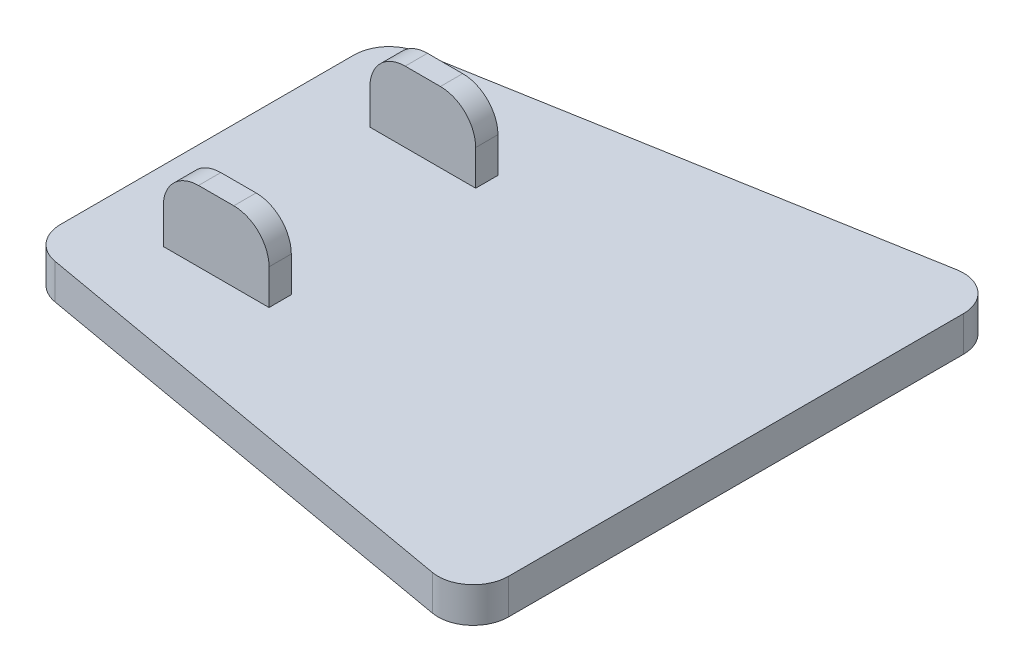
ISO-10303-21;
HEADER;
FILE_DESCRIPTION(('STEP AP214'),'2;1');
FILE_NAME('part.step','',(''),(''),'','','');
FILE_SCHEMA(('AUTOMOTIVE_DESIGN { 1 0 10303 214 1 1 1 1 }'));
ENDSEC;
DATA;
#1=APPLICATION_CONTEXT('core data for automotive mechanical design processes');
#2=APPLICATION_PROTOCOL_DEFINITION('international standard','automotive_design',2000,#1);
#3=PRODUCT_CONTEXT('',#1,'mechanical');
#4=PRODUCT('Part','Part','',(#3));
#5=PRODUCT_RELATED_PRODUCT_CATEGORY('part','',(#4));
#6=PRODUCT_DEFINITION_FORMATION('','',#4);
#7=PRODUCT_DEFINITION_CONTEXT('part definition',#1,'design');
#8=PRODUCT_DEFINITION('design','',#6,#7);
#9=PRODUCT_DEFINITION_SHAPE('','',#8);
#10=(LENGTH_UNIT() NAMED_UNIT(*) SI_UNIT(.MILLI.,.METRE.));
#11=(NAMED_UNIT(*) PLANE_ANGLE_UNIT() SI_UNIT($,.RADIAN.));
#12=(NAMED_UNIT(*) SI_UNIT($,.STERADIAN.) SOLID_ANGLE_UNIT());
#13=UNCERTAINTY_MEASURE_WITH_UNIT(LENGTH_MEASURE(1.E-05),#10,'distance_accuracy_value','');
#14=(GEOMETRIC_REPRESENTATION_CONTEXT(3) GLOBAL_UNCERTAINTY_ASSIGNED_CONTEXT((#13)) GLOBAL_UNIT_ASSIGNED_CONTEXT((#10,
#11,#12)) REPRESENTATION_CONTEXT('',''));
#15=CARTESIAN_POINT('',(0.,0.,0.));
#16=DIRECTION('',(0.,0.,1.));
#17=DIRECTION('',(1.,0.,0.));
#18=AXIS2_PLACEMENT_3D('',#15,#16,#17);
#19=CARTESIAN_POINT('',(0.,10.,0.));
#20=DIRECTION('',(0.,-1.,0.));
#21=DIRECTION('',(0.,0.,-1.));
#22=AXIS2_PLACEMENT_3D('',#19,#20,#21);
#23=PLANE('',#22);
#24=DIRECTION('',(0.,0.,1.));
#25=VECTOR('',#24,1.);
#26=CARTESIAN_POINT('',(20.,10.,-32.4728035453542));
#27=LINE('',#26,#25);
#28=CARTESIAN_POINT('',(20.,10.,-32.4728035453542));
#29=VERTEX_POINT('',#28);
#30=CARTESIAN_POINT('',(20.,10.,-26.1538642368434));
#31=VERTEX_POINT('',#30);
#32=EDGE_CURVE('E224',#29,#31,#27,.T.);
#33=ORIENTED_EDGE('',*,*,#32,.F.);
#34=DIRECTION('',(-1.,0.,0.));
#35=VECTOR('',#34,1.);
#36=CARTESIAN_POINT('',(20.,10.,-32.4728035453542));
#37=LINE('',#36,#35);
#38=CARTESIAN_POINT('',(50.,10.,-32.4728035453542));
#39=VERTEX_POINT('',#38);
#40=EDGE_CURVE('E229',#39,#29,#37,.T.);
#41=ORIENTED_EDGE('',*,*,#40,.F.);
#42=DIRECTION('',(0.,0.,-1.));
#43=VECTOR('',#42,1.);
#44=CARTESIAN_POINT('',(50.,10.,-32.4728035453542));
#45=LINE('',#44,#43);
#46=CARTESIAN_POINT('',(50.,10.,-26.1538642368434));
#47=VERTEX_POINT('',#46);
#48=EDGE_CURVE('E238',#47,#39,#45,.T.);
#49=ORIENTED_EDGE('',*,*,#48,.F.);
#50=DIRECTION('',(1.,0.,0.));
#51=VECTOR('',#50,1.);
#52=CARTESIAN_POINT('',(20.,10.,-26.1538642368434));
#53=LINE('',#52,#51);
#54=EDGE_CURVE('E235',#31,#47,#53,.T.);
#55=ORIENTED_EDGE('',*,*,#54,.F.);
#56=EDGE_LOOP('',(#33,#41,#49,#55));
#57=FACE_BOUND('',#56,.T.);
#58=DIRECTION('',(0.,0.,1.));
#59=VECTOR('',#58,1.);
#60=CARTESIAN_POINT('',(150.,10.,-76.4490471062692));
#61=LINE('',#60,#59);
#62=CARTESIAN_POINT('',(150.,10.,-64.5315111803272));
#63=VERTEX_POINT('',#62);
#64=CARTESIAN_POINT('',(150.,10.,64.5315111803271));
#65=VERTEX_POINT('',#64);
#66=EDGE_CURVE('E260',#63,#65,#61,.T.);
#67=ORIENTED_EDGE('',*,*,#66,.F.);
#68=CARTESIAN_POINT('',(140.,10.,-64.5315111803272));
#69=DIRECTION('',(0.,-1.,0.));
#70=DIRECTION('',(0.,0.,-1.));
#71=AXIS2_PLACEMENT_3D('',#68,#69,#70);
#72=CIRCLE('',#71,10.);
#73=CARTESIAN_POINT('',(138.263518223331,10.,-74.3795887104493));
#74=VERTEX_POINT('',#73);
#75=EDGE_CURVE('E314',#63,#74,#72,.F.);
#76=ORIENTED_EDGE('',*,*,#75,.T.);
#77=DIRECTION('',(0.984807753012209,0.,-0.173648177666927));
#78=VECTOR('',#77,1.);
#79=CARTESIAN_POINT('',(0.,10.,-50.));
#80=LINE('',#79,#78);
#81=CARTESIAN_POINT('',(8.26351822333073,10.,-51.4570812183493));
#82=VERTEX_POINT('',#81);
#83=EDGE_CURVE('E257',#82,#74,#80,.T.);
#84=ORIENTED_EDGE('',*,*,#83,.F.);
#85=CARTESIAN_POINT('',(10.,10.,-41.6090036882272));
#86=DIRECTION('',(0.,-1.,0.));
#87=DIRECTION('',(0.,0.,-1.));
#88=AXIS2_PLACEMENT_3D('',#85,#86,#87);
#89=CIRCLE('',#88,10.);
#90=CARTESIAN_POINT('',(0.,10.,-41.6090036882272));
#91=VERTEX_POINT('',#90);
#92=EDGE_CURVE('E48',#82,#91,#89,.F.);
#93=ORIENTED_EDGE('',*,*,#92,.T.);
#94=DIRECTION('',(0.,0.,-1.));
#95=VECTOR('',#94,1.);
#96=CARTESIAN_POINT('',(0.,10.,50.));
#97=LINE('',#96,#95);
#98=CARTESIAN_POINT('',(0.,10.,41.6090036882272));
#99=VERTEX_POINT('',#98);
#100=EDGE_CURVE('E254',#99,#91,#97,.T.);
#101=ORIENTED_EDGE('',*,*,#100,.F.);
#102=CARTESIAN_POINT('',(10.,10.,41.6090036882272));
#103=DIRECTION('',(0.,-1.,0.));
#104=DIRECTION('',(0.,0.,-1.));
#105=AXIS2_PLACEMENT_3D('',#102,#103,#104);
#106=CIRCLE('',#105,10.);
#107=CARTESIAN_POINT('',(8.26351822333071,10.,51.4570812183493));
#108=VERTEX_POINT('',#107);
#109=EDGE_CURVE('E310',#99,#108,#106,.F.);
#110=ORIENTED_EDGE('',*,*,#109,.T.);
#111=DIRECTION('',(-0.984807753012209,0.,-0.173648177666927));
#112=VECTOR('',#111,1.);
#113=CARTESIAN_POINT('',(150.,10.,76.4490471062691));
#114=LINE('',#113,#112);
#115=CARTESIAN_POINT('',(138.263518223331,10.,74.3795887104492));
#116=VERTEX_POINT('',#115);
#117=EDGE_CURVE('E251',#116,#108,#114,.T.);
#118=ORIENTED_EDGE('',*,*,#117,.F.);
#119=CARTESIAN_POINT('',(140.,10.,64.5315111803271));
#120=DIRECTION('',(0.,-1.,0.));
#121=DIRECTION('',(0.,0.,-1.));
#122=AXIS2_PLACEMENT_3D('',#119,#120,#121);
#123=CIRCLE('',#122,10.);
#124=EDGE_CURVE('E312',#116,#65,#123,.F.);
#125=ORIENTED_EDGE('',*,*,#124,.T.);
#126=EDGE_LOOP('',(#67,#76,#84,#93,#101,#110,#118,#125));
#127=FACE_BOUND('',#126,.T.);
#128=DIRECTION('',(0.,0.,-1.));
#129=VECTOR('',#128,1.);
#130=CARTESIAN_POINT('',(20.,10.,32.4728035453542));
#131=LINE('',#130,#129);
#132=CARTESIAN_POINT('',(20.,10.,32.4728035453542));
#133=VERTEX_POINT('',#132);
#134=CARTESIAN_POINT('',(20.,10.,26.1538642368434));
#135=VERTEX_POINT('',#134);
#136=EDGE_CURVE('E588',#133,#135,#131,.T.);
#137=ORIENTED_EDGE('',*,*,#136,.T.);
#138=DIRECTION('',(1.,0.,0.));
#139=VECTOR('',#138,1.);
#140=CARTESIAN_POINT('',(20.,10.,26.1538642368434));
#141=LINE('',#140,#139);
#142=CARTESIAN_POINT('',(50.,10.,26.1538642368434));
#143=VERTEX_POINT('',#142);
#144=EDGE_CURVE('E175',#135,#143,#141,.T.);
#145=ORIENTED_EDGE('',*,*,#144,.T.);
#146=DIRECTION('',(0.,0.,1.));
#147=VECTOR('',#146,1.);
#148=CARTESIAN_POINT('',(50.,10.,32.4728035453542));
#149=LINE('',#148,#147);
#150=CARTESIAN_POINT('',(50.,10.,32.4728035453542));
#151=VERTEX_POINT('',#150);
#152=EDGE_CURVE('E169',#143,#151,#149,.T.);
#153=ORIENTED_EDGE('',*,*,#152,.T.);
#154=DIRECTION('',(-1.,0.,0.));
#155=VECTOR('',#154,1.);
#156=CARTESIAN_POINT('',(20.,10.,32.4728035453542));
#157=LINE('',#156,#155);
#158=EDGE_CURVE('E172',#151,#133,#157,.T.);
#159=ORIENTED_EDGE('',*,*,#158,.T.);
#160=EDGE_LOOP('',(#137,#145,#153,#159));
#161=FACE_BOUND('',#160,.T.);
#162=ADVANCED_FACE('F33',(#57,#127,#161),#23,.F.);
#163=CARTESIAN_POINT('',(150.,10.,76.4490471062691));
#164=DIRECTION('',(-0.173648177666927,0.,0.984807753012209));
#165=DIRECTION('',(0.984807753012209,0.,0.173648177666927));
#166=AXIS2_PLACEMENT_3D('',#163,#164,#165);
#167=PLANE('',#166);
#168=DIRECTION('',(-0.984807753012209,0.,-0.173648177666927));
#169=VECTOR('',#168,1.);
#170=CARTESIAN_POINT('',(150.,0.,76.4490471062691));
#171=LINE('',#170,#169);
#172=CARTESIAN_POINT('',(138.263518223331,0.,74.3795887104492));
#173=VERTEX_POINT('',#172);
#174=CARTESIAN_POINT('',(8.26351822333071,0.,51.4570812183493));
#175=VERTEX_POINT('',#174);
#176=EDGE_CURVE('E250',#173,#175,#171,.T.);
#177=ORIENTED_EDGE('',*,*,#176,.F.);
#178=DIRECTION('',(0.,-1.,0.));
#179=VECTOR('',#178,1.);
#180=CARTESIAN_POINT('',(138.263518223331,10.,74.3795887104492));
#181=LINE('',#180,#179);
#182=EDGE_CURVE('E319',#173,#116,#181,.F.);
#183=ORIENTED_EDGE('',*,*,#182,.T.);
#184=ORIENTED_EDGE('',*,*,#117,.T.);
#185=DIRECTION('',(0.,-1.,0.));
#186=VECTOR('',#185,1.);
#187=CARTESIAN_POINT('',(8.26351822333074,10.,51.4570812183493));
#188=LINE('',#187,#186);
#189=EDGE_CURVE('E316',#108,#175,#188,.T.);
#190=ORIENTED_EDGE('',*,*,#189,.T.);
#191=EDGE_LOOP('',(#177,#183,#184,#190));
#192=FACE_BOUND('',#191,.T.);
#193=ADVANCED_FACE('F333',(#192),#167,.T.);
#194=CARTESIAN_POINT('',(150.,10.,-76.4490471062692));
#195=DIRECTION('',(1.,0.,0.));
#196=DIRECTION('',(0.,0.,-1.));
#197=AXIS2_PLACEMENT_3D('',#194,#195,#196);
#198=PLANE('',#197);
#199=DIRECTION('',(0.,0.,1.));
#200=VECTOR('',#199,1.);
#201=CARTESIAN_POINT('',(150.,0.,-76.4490471062692));
#202=LINE('',#201,#200);
#203=CARTESIAN_POINT('',(150.,0.,-64.5315111803272));
#204=VERTEX_POINT('',#203);
#205=CARTESIAN_POINT('',(150.,0.,64.5315111803271));
#206=VERTEX_POINT('',#205);
#207=EDGE_CURVE('E255',#204,#206,#202,.T.);
#208=ORIENTED_EDGE('',*,*,#207,.F.);
#209=DIRECTION('',(0.,-1.,0.));
#210=VECTOR('',#209,1.);
#211=CARTESIAN_POINT('',(150.,10.,-64.5315111803272));
#212=LINE('',#211,#210);
#213=EDGE_CURVE('E307',#204,#63,#212,.F.);
#214=ORIENTED_EDGE('',*,*,#213,.T.);
#215=ORIENTED_EDGE('',*,*,#66,.T.);
#216=DIRECTION('',(0.,-1.,0.));
#217=VECTOR('',#216,1.);
#218=CARTESIAN_POINT('',(150.,10.,64.5315111803271));
#219=LINE('',#218,#217);
#220=EDGE_CURVE('E304',#65,#206,#219,.T.);
#221=ORIENTED_EDGE('',*,*,#220,.T.);
#222=EDGE_LOOP('',(#208,#214,#215,#221));
#223=FACE_BOUND('',#222,.T.);
#224=ADVANCED_FACE('F343',(#223),#198,.T.);
#225=CARTESIAN_POINT('',(0.,10.,-50.));
#226=DIRECTION('',(-0.173648177666927,0.,-0.984807753012209));
#227=DIRECTION('',(-0.984807753012209,0.,0.173648177666927));
#228=AXIS2_PLACEMENT_3D('',#225,#226,#227);
#229=PLANE('',#228);
#230=ORIENTED_EDGE('',*,*,#83,.T.);
#231=DIRECTION('',(0.,-1.,0.));
#232=VECTOR('',#231,1.);
#233=CARTESIAN_POINT('',(138.263518223331,10.,-74.3795887104493));
#234=LINE('',#233,#232);
#235=CARTESIAN_POINT('',(138.263518223331,0.,-74.3795887104493));
#236=VERTEX_POINT('',#235);
#237=EDGE_CURVE('E293',#74,#236,#234,.T.);
#238=ORIENTED_EDGE('',*,*,#237,.T.);
#239=DIRECTION('',(0.984807753012209,0.,-0.173648177666927));
#240=VECTOR('',#239,1.);
#241=CARTESIAN_POINT('',(0.,0.,-50.));
#242=LINE('',#241,#240);
#243=CARTESIAN_POINT('',(8.26351822333073,0.,-51.4570812183493));
#244=VERTEX_POINT('',#243);
#245=EDGE_CURVE('E269',#244,#236,#242,.T.);
#246=ORIENTED_EDGE('',*,*,#245,.F.);
#247=DIRECTION('',(0.,-1.,0.));
#248=VECTOR('',#247,1.);
#249=CARTESIAN_POINT('',(8.26351822333073,10.,-51.4570812183493));
#250=LINE('',#249,#248);
#251=EDGE_CURVE('E291',#244,#82,#250,.F.);
#252=ORIENTED_EDGE('',*,*,#251,.T.);
#253=EDGE_LOOP('',(#230,#238,#246,#252));
#254=FACE_BOUND('',#253,.T.);
#255=ADVANCED_FACE('F350',(#254),#229,.T.);
#256=CARTESIAN_POINT('',(0.,10.,0.));
#257=DIRECTION('',(-1.,0.,0.));
#258=DIRECTION('',(0.,0.,1.));
#259=AXIS2_PLACEMENT_3D('',#256,#257,#258);
#260=PLANE('',#259);
#261=DIRECTION('',(0.,0.,-1.));
#262=VECTOR('',#261,1.);
#263=CARTESIAN_POINT('',(0.,0.,0.));
#264=LINE('',#263,#262);
#265=CARTESIAN_POINT('',(0.,0.,41.6090036882272));
#266=VERTEX_POINT('',#265);
#267=CARTESIAN_POINT('',(0.,0.,-41.6090036882272));
#268=VERTEX_POINT('',#267);
#269=EDGE_CURVE('E266',#266,#268,#264,.T.);
#270=ORIENTED_EDGE('',*,*,#269,.F.);
#271=DIRECTION('',(0.,-1.,0.));
#272=VECTOR('',#271,1.);
#273=CARTESIAN_POINT('',(0.,10.,41.6090036882272));
#274=LINE('',#273,#272);
#275=EDGE_CURVE('E11',#266,#99,#274,.F.);
#276=ORIENTED_EDGE('',*,*,#275,.T.);
#277=ORIENTED_EDGE('',*,*,#100,.T.);
#278=DIRECTION('',(0.,-1.,0.));
#279=VECTOR('',#278,1.);
#280=CARTESIAN_POINT('',(0.,10.,-41.6090036882272));
#281=LINE('',#280,#279);
#282=EDGE_CURVE('E41',#91,#268,#281,.T.);
#283=ORIENTED_EDGE('',*,*,#282,.T.);
#284=EDGE_LOOP('',(#270,#276,#277,#283));
#285=FACE_BOUND('',#284,.T.);
#286=ADVANCED_FACE('F322',(#285),#260,.T.);
#287=CARTESIAN_POINT('',(0.,0.,0.));
#288=DIRECTION('',(0.,-1.,0.));
#289=DIRECTION('',(0.,0.,-1.));
#290=AXIS2_PLACEMENT_3D('',#287,#288,#289);
#291=PLANE('',#290);
#292=ORIENTED_EDGE('',*,*,#245,.T.);
#293=CARTESIAN_POINT('',(140.,0.,-64.5315111803272));
#294=DIRECTION('',(0.,-1.,0.));
#295=DIRECTION('',(0.,0.,-1.));
#296=AXIS2_PLACEMENT_3D('',#293,#294,#295);
#297=CIRCLE('',#296,10.);
#298=EDGE_CURVE('E302',#236,#204,#297,.T.);
#299=ORIENTED_EDGE('',*,*,#298,.T.);
#300=ORIENTED_EDGE('',*,*,#207,.T.);
#301=CARTESIAN_POINT('',(140.,0.,64.5315111803271));
#302=DIRECTION('',(0.,-1.,0.));
#303=DIRECTION('',(0.,0.,-1.));
#304=AXIS2_PLACEMENT_3D('',#301,#302,#303);
#305=CIRCLE('',#304,10.);
#306=EDGE_CURVE('E300',#206,#173,#305,.T.);
#307=ORIENTED_EDGE('',*,*,#306,.T.);
#308=ORIENTED_EDGE('',*,*,#176,.T.);
#309=CARTESIAN_POINT('',(10.,0.,41.6090036882272));
#310=DIRECTION('',(0.,-1.,0.));
#311=DIRECTION('',(0.,0.,-1.));
#312=AXIS2_PLACEMENT_3D('',#309,#310,#311);
#313=CIRCLE('',#312,10.);
#314=EDGE_CURVE('E298',#175,#266,#313,.T.);
#315=ORIENTED_EDGE('',*,*,#314,.T.);
#316=ORIENTED_EDGE('',*,*,#269,.T.);
#317=CARTESIAN_POINT('',(10.,0.,-41.6090036882272));
#318=DIRECTION('',(0.,-1.,0.));
#319=DIRECTION('',(0.,0.,-1.));
#320=AXIS2_PLACEMENT_3D('',#317,#318,#319);
#321=CIRCLE('',#320,10.);
#322=EDGE_CURVE('E296',#268,#244,#321,.T.);
#323=ORIENTED_EDGE('',*,*,#322,.T.);
#324=EDGE_LOOP('',(#292,#299,#300,#307,#308,#315,#316,#323));
#325=FACE_BOUND('',#324,.T.);
#326=ADVANCED_FACE('F325',(#325),#291,.T.);
#327=CARTESIAN_POINT('',(20.,30.,-32.4728035453542));
#328=DIRECTION('',(1.,0.,0.));
#329=DIRECTION('',(0.,0.,-1.));
#330=AXIS2_PLACEMENT_3D('',#327,#328,#329);
#331=PLANE('',#330);
#332=DIRECTION('',(0.,-1.,0.));
#333=VECTOR('',#332,1.);
#334=CARTESIAN_POINT('',(20.,30.,-26.1538642368434));
#335=LINE('',#334,#333);
#336=CARTESIAN_POINT('',(20.,20.,-26.1538642368434));
#337=VERTEX_POINT('',#336);
#338=EDGE_CURVE('E248',#337,#31,#335,.T.);
#339=ORIENTED_EDGE('',*,*,#338,.F.);
#340=DIRECTION('',(0.,0.,1.));
#341=VECTOR('',#340,1.);
#342=CARTESIAN_POINT('',(20.,20.,-32.4728035453542));
#343=LINE('',#342,#341);
#344=CARTESIAN_POINT('',(20.,20.,-32.4728035453542));
#345=VERTEX_POINT('',#344);
#346=EDGE_CURVE('E289',#337,#345,#343,.F.);
#347=ORIENTED_EDGE('',*,*,#346,.T.);
#348=DIRECTION('',(0.,-1.,0.));
#349=VECTOR('',#348,1.);
#350=CARTESIAN_POINT('',(20.,30.,-32.4728035453542));
#351=LINE('',#350,#349);
#352=EDGE_CURVE('E232',#345,#29,#351,.T.);
#353=ORIENTED_EDGE('',*,*,#352,.T.);
#354=ORIENTED_EDGE('',*,*,#32,.T.);
#355=EDGE_LOOP('',(#339,#347,#353,#354));
#356=FACE_BOUND('',#355,.T.);
#357=ADVANCED_FACE('F366',(#356),#331,.F.);
#358=CARTESIAN_POINT('',(20.,30.,-26.1538642368434));
#359=DIRECTION('',(0.,0.,-1.));
#360=DIRECTION('',(-1.,0.,0.));
#361=AXIS2_PLACEMENT_3D('',#358,#359,#360);
#362=PLANE('',#361);
#363=DIRECTION('',(0.,-1.,0.));
#364=VECTOR('',#363,1.);
#365=CARTESIAN_POINT('',(50.,30.,-26.1538642368434));
#366=LINE('',#365,#364);
#367=CARTESIAN_POINT('',(50.,20.,-26.1538642368434));
#368=VERTEX_POINT('',#367);
#369=EDGE_CURVE('E246',#368,#47,#366,.T.);
#370=ORIENTED_EDGE('',*,*,#369,.F.);
#371=CARTESIAN_POINT('',(40.,20.,-26.1538642368434));
#372=DIRECTION('',(0.,0.,-1.));
#373=DIRECTION('',(-1.,0.,0.));
#374=AXIS2_PLACEMENT_3D('',#371,#372,#373);
#375=CIRCLE('',#374,10.);
#376=CARTESIAN_POINT('',(40.,30.,-26.1538642368434));
#377=VERTEX_POINT('',#376);
#378=EDGE_CURVE('E287',#368,#377,#375,.F.);
#379=ORIENTED_EDGE('',*,*,#378,.T.);
#380=DIRECTION('',(1.,0.,0.));
#381=VECTOR('',#380,1.);
#382=CARTESIAN_POINT('',(20.,30.,-26.1538642368434));
#383=LINE('',#382,#381);
#384=CARTESIAN_POINT('',(30.,30.,-26.1538642368434));
#385=VERTEX_POINT('',#384);
#386=EDGE_CURVE('E225',#385,#377,#383,.T.);
#387=ORIENTED_EDGE('',*,*,#386,.F.);
#388=CARTESIAN_POINT('',(30.,20.,-26.1538642368434));
#389=DIRECTION('',(0.,0.,-1.));
#390=DIRECTION('',(-1.,0.,0.));
#391=AXIS2_PLACEMENT_3D('',#388,#389,#390);
#392=CIRCLE('',#391,10.);
#393=EDGE_CURVE('E285',#385,#337,#392,.F.);
#394=ORIENTED_EDGE('',*,*,#393,.T.);
#395=ORIENTED_EDGE('',*,*,#338,.T.);
#396=ORIENTED_EDGE('',*,*,#54,.T.);
#397=EDGE_LOOP('',(#370,#379,#387,#394,#395,#396));
#398=FACE_BOUND('',#397,.T.);
#399=ADVANCED_FACE('F501',(#398),#362,.F.);
#400=CARTESIAN_POINT('',(50.,30.,-32.4728035453542));
#401=DIRECTION('',(-1.,0.,0.));
#402=DIRECTION('',(0.,0.,1.));
#403=AXIS2_PLACEMENT_3D('',#400,#401,#402);
#404=PLANE('',#403);
#405=DIRECTION('',(0.,-1.,0.));
#406=VECTOR('',#405,1.);
#407=CARTESIAN_POINT('',(50.,30.,-32.4728035453542));
#408=LINE('',#407,#406);
#409=CARTESIAN_POINT('',(50.,20.,-32.4728035453542));
#410=VERTEX_POINT('',#409);
#411=EDGE_CURVE('E244',#410,#39,#408,.T.);
#412=ORIENTED_EDGE('',*,*,#411,.F.);
#413=DIRECTION('',(0.,0.,-1.));
#414=VECTOR('',#413,1.);
#415=CARTESIAN_POINT('',(50.,20.,-26.1538642368434));
#416=LINE('',#415,#414);
#417=EDGE_CURVE('E283',#410,#368,#416,.F.);
#418=ORIENTED_EDGE('',*,*,#417,.T.);
#419=ORIENTED_EDGE('',*,*,#369,.T.);
#420=ORIENTED_EDGE('',*,*,#48,.T.);
#421=EDGE_LOOP('',(#412,#418,#419,#420));
#422=FACE_BOUND('',#421,.T.);
#423=ADVANCED_FACE('F491',(#422),#404,.F.);
#424=CARTESIAN_POINT('',(20.,30.,-32.4728035453542));
#425=DIRECTION('',(0.,0.,1.));
#426=DIRECTION('',(1.,0.,0.));
#427=AXIS2_PLACEMENT_3D('',#424,#425,#426);
#428=PLANE('',#427);
#429=DIRECTION('',(-1.,0.,0.));
#430=VECTOR('',#429,1.);
#431=CARTESIAN_POINT('',(20.,30.,-32.4728035453542));
#432=LINE('',#431,#430);
#433=CARTESIAN_POINT('',(40.,30.,-32.4728035453542));
#434=VERTEX_POINT('',#433);
#435=CARTESIAN_POINT('',(30.,30.,-32.4728035453542));
#436=VERTEX_POINT('',#435);
#437=EDGE_CURVE('E228',#434,#436,#432,.T.);
#438=ORIENTED_EDGE('',*,*,#437,.F.);
#439=CARTESIAN_POINT('',(40.,20.,-32.4728035453542));
#440=DIRECTION('',(0.,0.,1.));
#441=DIRECTION('',(1.,0.,0.));
#442=AXIS2_PLACEMENT_3D('',#439,#440,#441);
#443=CIRCLE('',#442,10.);
#444=EDGE_CURVE('E281',#434,#410,#443,.F.);
#445=ORIENTED_EDGE('',*,*,#444,.T.);
#446=ORIENTED_EDGE('',*,*,#411,.T.);
#447=ORIENTED_EDGE('',*,*,#40,.T.);
#448=ORIENTED_EDGE('',*,*,#352,.F.);
#449=CARTESIAN_POINT('',(30.,20.,-32.4728035453542));
#450=DIRECTION('',(0.,0.,1.));
#451=DIRECTION('',(1.,0.,0.));
#452=AXIS2_PLACEMENT_3D('',#449,#450,#451);
#453=CIRCLE('',#452,10.);
#454=EDGE_CURVE('E279',#345,#436,#453,.F.);
#455=ORIENTED_EDGE('',*,*,#454,.T.);
#456=EDGE_LOOP('',(#438,#445,#446,#447,#448,#455));
#457=FACE_BOUND('',#456,.T.);
#458=ADVANCED_FACE('F481',(#457),#428,.F.);
#459=CARTESIAN_POINT('',(0.,30.,0.));
#460=DIRECTION('',(0.,1.,0.));
#461=DIRECTION('',(0.,0.,1.));
#462=AXIS2_PLACEMENT_3D('',#459,#460,#461);
#463=PLANE('',#462);
#464=ORIENTED_EDGE('',*,*,#386,.T.);
#465=DIRECTION('',(0.,0.,-1.));
#466=VECTOR('',#465,1.);
#467=CARTESIAN_POINT('',(40.,30.,-32.4728035453542));
#468=LINE('',#467,#466);
#469=EDGE_CURVE('E276',#377,#434,#468,.T.);
#470=ORIENTED_EDGE('',*,*,#469,.T.);
#471=ORIENTED_EDGE('',*,*,#437,.T.);
#472=DIRECTION('',(0.,0.,1.));
#473=VECTOR('',#472,1.);
#474=CARTESIAN_POINT('',(30.,30.,-26.1538642368434));
#475=LINE('',#474,#473);
#476=EDGE_CURVE('E263',#436,#385,#475,.T.);
#477=ORIENTED_EDGE('',*,*,#476,.T.);
#478=EDGE_LOOP('',(#464,#470,#471,#477));
#479=FACE_BOUND('',#478,.T.);
#480=ADVANCED_FACE('F380',(#479),#463,.T.);
#481=CARTESIAN_POINT('',(40.,20.,0.));
#482=DIRECTION('',(0.,0.,1.));
#483=DIRECTION('',(1.,0.,0.));
#484=AXIS2_PLACEMENT_3D('',#481,#482,#483);
#485=CYLINDRICAL_SURFACE('',#484,10.);
#486=ORIENTED_EDGE('',*,*,#378,.F.);
#487=ORIENTED_EDGE('',*,*,#417,.F.);
#488=ORIENTED_EDGE('',*,*,#444,.F.);
#489=ORIENTED_EDGE('',*,*,#469,.F.);
#490=EDGE_LOOP('',(#486,#487,#488,#489));
#491=FACE_BOUND('',#490,.T.);
#492=ADVANCED_FACE('F376',(#491),#485,.T.);
#493=CARTESIAN_POINT('',(30.,20.,0.));
#494=DIRECTION('',(0.,0.,-1.));
#495=DIRECTION('',(-1.,0.,0.));
#496=AXIS2_PLACEMENT_3D('',#493,#494,#495);
#497=CYLINDRICAL_SURFACE('',#496,10.);
#498=ORIENTED_EDGE('',*,*,#454,.F.);
#499=ORIENTED_EDGE('',*,*,#346,.F.);
#500=ORIENTED_EDGE('',*,*,#393,.F.);
#501=ORIENTED_EDGE('',*,*,#476,.F.);
#502=EDGE_LOOP('',(#498,#499,#500,#501));
#503=FACE_BOUND('',#502,.T.);
#504=ADVANCED_FACE('F379',(#503),#497,.T.);
#505=CARTESIAN_POINT('',(20.,30.,32.4728035453542));
#506=DIRECTION('',(1.,0.,0.));
#507=DIRECTION('',(0.,0.,1.));
#508=AXIS2_PLACEMENT_3D('',#505,#506,#507);
#509=PLANE('',#508);
#510=DIRECTION('',(0.,-1.,0.));
#511=VECTOR('',#510,1.);
#512=CARTESIAN_POINT('',(20.,30.,26.1538642368434));
#513=LINE('',#512,#511);
#514=CARTESIAN_POINT('',(20.,20.,26.1538642368434));
#515=VERTEX_POINT('',#514);
#516=EDGE_CURVE('E203',#515,#135,#513,.T.);
#517=ORIENTED_EDGE('',*,*,#516,.T.);
#518=ORIENTED_EDGE('',*,*,#136,.F.);
#519=DIRECTION('',(0.,-1.,0.));
#520=VECTOR('',#519,1.);
#521=CARTESIAN_POINT('',(20.,30.,32.4728035453542));
#522=LINE('',#521,#520);
#523=CARTESIAN_POINT('',(20.,20.,32.4728035453542));
#524=VERTEX_POINT('',#523);
#525=EDGE_CURVE('E188',#524,#133,#522,.T.);
#526=ORIENTED_EDGE('',*,*,#525,.F.);
#527=DIRECTION('',(0.,0.,-1.));
#528=VECTOR('',#527,1.);
#529=CARTESIAN_POINT('',(20.,20.,32.4728035453542));
#530=LINE('',#529,#528);
#531=EDGE_CURVE('E221',#515,#524,#530,.F.);
#532=ORIENTED_EDGE('',*,*,#531,.F.);
#533=EDGE_LOOP('',(#517,#518,#526,#532));
#534=FACE_BOUND('',#533,.T.);
#535=ADVANCED_FACE('F384',(#534),#509,.F.);
#536=CARTESIAN_POINT('',(20.,30.,26.1538642368434));
#537=DIRECTION('',(0.,0.,1.));
#538=DIRECTION('',(-1.,0.,0.));
#539=AXIS2_PLACEMENT_3D('',#536,#537,#538);
#540=PLANE('',#539);
#541=DIRECTION('',(0.,-1.,0.));
#542=VECTOR('',#541,1.);
#543=CARTESIAN_POINT('',(50.,30.,26.1538642368434));
#544=LINE('',#543,#542);
#545=CARTESIAN_POINT('',(50.,20.,26.1538642368434));
#546=VERTEX_POINT('',#545);
#547=EDGE_CURVE('E187',#546,#143,#544,.T.);
#548=ORIENTED_EDGE('',*,*,#547,.T.);
#549=ORIENTED_EDGE('',*,*,#144,.F.);
#550=ORIENTED_EDGE('',*,*,#516,.F.);
#551=CARTESIAN_POINT('',(30.,20.,26.1538642368434));
#552=DIRECTION('',(0.,0.,-1.));
#553=DIRECTION('',(-1.,0.,0.));
#554=AXIS2_PLACEMENT_3D('',#551,#552,#553);
#555=CIRCLE('',#554,10.);
#556=CARTESIAN_POINT('',(30.,30.,26.1538642368434));
#557=VERTEX_POINT('',#556);
#558=EDGE_CURVE('E216',#557,#515,#555,.F.);
#559=ORIENTED_EDGE('',*,*,#558,.F.);
#560=DIRECTION('',(1.,0.,0.));
#561=VECTOR('',#560,1.);
#562=CARTESIAN_POINT('',(20.,30.,26.1538642368434));
#563=LINE('',#562,#561);
#564=CARTESIAN_POINT('',(40.,30.,26.1538642368434));
#565=VERTEX_POINT('',#564);
#566=EDGE_CURVE('E194',#557,#565,#563,.T.);
#567=ORIENTED_EDGE('',*,*,#566,.T.);
#568=CARTESIAN_POINT('',(40.,20.,26.1538642368434));
#569=DIRECTION('',(0.,0.,-1.));
#570=DIRECTION('',(-1.,0.,0.));
#571=AXIS2_PLACEMENT_3D('',#568,#569,#570);
#572=CIRCLE('',#571,10.);
#573=EDGE_CURVE('E218',#546,#565,#572,.F.);
#574=ORIENTED_EDGE('',*,*,#573,.F.);
#575=EDGE_LOOP('',(#548,#549,#550,#559,#567,#574));
#576=FACE_BOUND('',#575,.T.);
#577=ADVANCED_FACE('F452',(#576),#540,.F.);
#578=CARTESIAN_POINT('',(50.,30.,32.4728035453542));
#579=DIRECTION('',(-1.,0.,0.));
#580=DIRECTION('',(0.,0.,-1.));
#581=AXIS2_PLACEMENT_3D('',#578,#579,#580);
#582=PLANE('',#581);
#583=DIRECTION('',(0.,-1.,0.));
#584=VECTOR('',#583,1.);
#585=CARTESIAN_POINT('',(50.,30.,32.4728035453542));
#586=LINE('',#585,#584);
#587=CARTESIAN_POINT('',(50.,20.,32.4728035453542));
#588=VERTEX_POINT('',#587);
#589=EDGE_CURVE('E182',#588,#151,#586,.T.);
#590=ORIENTED_EDGE('',*,*,#589,.T.);
#591=ORIENTED_EDGE('',*,*,#152,.F.);
#592=ORIENTED_EDGE('',*,*,#547,.F.);
#593=DIRECTION('',(0.,0.,1.));
#594=VECTOR('',#593,1.);
#595=CARTESIAN_POINT('',(50.,20.,26.1538642368434));
#596=LINE('',#595,#594);
#597=EDGE_CURVE('E184',#588,#546,#596,.F.);
#598=ORIENTED_EDGE('',*,*,#597,.F.);
#599=EDGE_LOOP('',(#590,#591,#592,#598));
#600=FACE_BOUND('',#599,.T.);
#601=ADVANCED_FACE('F183',(#600),#582,.F.);
#602=CARTESIAN_POINT('',(20.,30.,32.4728035453542));
#603=DIRECTION('',(0.,0.,-1.));
#604=DIRECTION('',(1.,0.,0.));
#605=AXIS2_PLACEMENT_3D('',#602,#603,#604);
#606=PLANE('',#605);
#607=DIRECTION('',(-1.,0.,0.));
#608=VECTOR('',#607,1.);
#609=CARTESIAN_POINT('',(20.,30.,32.4728035453542));
#610=LINE('',#609,#608);
#611=CARTESIAN_POINT('',(40.,30.,32.4728035453542));
#612=VERTEX_POINT('',#611);
#613=CARTESIAN_POINT('',(30.,30.,32.4728035453542));
#614=VERTEX_POINT('',#613);
#615=EDGE_CURVE('E197',#612,#614,#610,.T.);
#616=ORIENTED_EDGE('',*,*,#615,.T.);
#617=CARTESIAN_POINT('',(30.,20.,32.4728035453542));
#618=DIRECTION('',(0.,0.,1.));
#619=DIRECTION('',(1.,0.,0.));
#620=AXIS2_PLACEMENT_3D('',#617,#618,#619);
#621=CIRCLE('',#620,10.);
#622=EDGE_CURVE('E210',#524,#614,#621,.F.);
#623=ORIENTED_EDGE('',*,*,#622,.F.);
#624=ORIENTED_EDGE('',*,*,#525,.T.);
#625=ORIENTED_EDGE('',*,*,#158,.F.);
#626=ORIENTED_EDGE('',*,*,#589,.F.);
#627=CARTESIAN_POINT('',(40.,20.,32.4728035453542));
#628=DIRECTION('',(0.,0.,1.));
#629=DIRECTION('',(1.,0.,0.));
#630=AXIS2_PLACEMENT_3D('',#627,#628,#629);
#631=CIRCLE('',#630,10.);
#632=EDGE_CURVE('E213',#612,#588,#631,.F.);
#633=ORIENTED_EDGE('',*,*,#632,.F.);
#634=EDGE_LOOP('',(#616,#623,#624,#625,#626,#633));
#635=FACE_BOUND('',#634,.T.);
#636=ADVANCED_FACE('F191',(#635),#606,.F.);
#637=CARTESIAN_POINT('',(0.,30.,0.));
#638=DIRECTION('',(0.,1.,0.));
#639=DIRECTION('',(0.,0.,-1.));
#640=AXIS2_PLACEMENT_3D('',#637,#638,#639);
#641=PLANE('',#640);
#642=ORIENTED_EDGE('',*,*,#566,.F.);
#643=DIRECTION('',(0.,0.,-1.));
#644=VECTOR('',#643,1.);
#645=CARTESIAN_POINT('',(30.,30.,26.1538642368434));
#646=LINE('',#645,#644);
#647=EDGE_CURVE('E206',#614,#557,#646,.T.);
#648=ORIENTED_EDGE('',*,*,#647,.F.);
#649=ORIENTED_EDGE('',*,*,#615,.F.);
#650=DIRECTION('',(0.,0.,1.));
#651=VECTOR('',#650,1.);
#652=CARTESIAN_POINT('',(40.,30.,32.4728035453542));
#653=LINE('',#652,#651);
#654=EDGE_CURVE('E208',#565,#612,#653,.T.);
#655=ORIENTED_EDGE('',*,*,#654,.F.);
#656=EDGE_LOOP('',(#642,#648,#649,#655));
#657=FACE_BOUND('',#656,.T.);
#658=ADVANCED_FACE('F428',(#657),#641,.T.);
#659=CARTESIAN_POINT('',(40.,20.,0.));
#660=DIRECTION('',(0.,0.,-1.));
#661=DIRECTION('',(1.,0.,0.));
#662=AXIS2_PLACEMENT_3D('',#659,#660,#661);
#663=CYLINDRICAL_SURFACE('',#662,10.);
#664=ORIENTED_EDGE('',*,*,#573,.T.);
#665=ORIENTED_EDGE('',*,*,#654,.T.);
#666=ORIENTED_EDGE('',*,*,#632,.T.);
#667=ORIENTED_EDGE('',*,*,#597,.T.);
#668=EDGE_LOOP('',(#664,#665,#666,#667));
#669=FACE_BOUND('',#668,.T.);
#670=ADVANCED_FACE('F419',(#669),#663,.T.);
#671=CARTESIAN_POINT('',(30.,20.,0.));
#672=DIRECTION('',(0.,0.,1.));
#673=DIRECTION('',(-1.,0.,0.));
#674=AXIS2_PLACEMENT_3D('',#671,#672,#673);
#675=CYLINDRICAL_SURFACE('',#674,10.);
#676=ORIENTED_EDGE('',*,*,#622,.T.);
#677=ORIENTED_EDGE('',*,*,#647,.T.);
#678=ORIENTED_EDGE('',*,*,#558,.T.);
#679=ORIENTED_EDGE('',*,*,#531,.T.);
#680=EDGE_LOOP('',(#676,#677,#678,#679));
#681=FACE_BOUND('',#680,.T.);
#682=ADVANCED_FACE('F388',(#681),#675,.T.);
#683=CARTESIAN_POINT('',(140.,10.,-64.5315111803272));
#684=DIRECTION('',(0.,-1.,0.));
#685=DIRECTION('',(0.,0.,-1.));
#686=AXIS2_PLACEMENT_3D('',#683,#684,#685);
#687=CYLINDRICAL_SURFACE('',#686,10.);
#688=ORIENTED_EDGE('',*,*,#75,.F.);
#689=ORIENTED_EDGE('',*,*,#213,.F.);
#690=ORIENTED_EDGE('',*,*,#298,.F.);
#691=ORIENTED_EDGE('',*,*,#237,.F.);
#692=EDGE_LOOP('',(#688,#689,#690,#691));
#693=FACE_BOUND('',#692,.T.);
#694=ADVANCED_FACE('F348',(#693),#687,.T.);
#695=CARTESIAN_POINT('',(140.,10.,64.5315111803271));
#696=DIRECTION('',(0.,-1.,0.));
#697=DIRECTION('',(0.,0.,-1.));
#698=AXIS2_PLACEMENT_3D('',#695,#696,#697);
#699=CYLINDRICAL_SURFACE('',#698,10.);
#700=ORIENTED_EDGE('',*,*,#124,.F.);
#701=ORIENTED_EDGE('',*,*,#182,.F.);
#702=ORIENTED_EDGE('',*,*,#306,.F.);
#703=ORIENTED_EDGE('',*,*,#220,.F.);
#704=EDGE_LOOP('',(#700,#701,#702,#703));
#705=FACE_BOUND('',#704,.T.);
#706=ADVANCED_FACE('F340',(#705),#699,.T.);
#707=CARTESIAN_POINT('',(10.,10.,41.6090036882272));
#708=DIRECTION('',(0.,-1.,0.));
#709=DIRECTION('',(0.,0.,-1.));
#710=AXIS2_PLACEMENT_3D('',#707,#708,#709);
#711=CYLINDRICAL_SURFACE('',#710,10.);
#712=ORIENTED_EDGE('',*,*,#109,.F.);
#713=ORIENTED_EDGE('',*,*,#275,.F.);
#714=ORIENTED_EDGE('',*,*,#314,.F.);
#715=ORIENTED_EDGE('',*,*,#189,.F.);
#716=EDGE_LOOP('',(#712,#713,#714,#715));
#717=FACE_BOUND('',#716,.T.);
#718=ADVANCED_FACE('F331',(#717),#711,.T.);
#719=CARTESIAN_POINT('',(10.,10.,-41.6090036882272));
#720=DIRECTION('',(0.,-1.,0.));
#721=DIRECTION('',(0.,0.,-1.));
#722=AXIS2_PLACEMENT_3D('',#719,#720,#721);
#723=CYLINDRICAL_SURFACE('',#722,10.);
#724=ORIENTED_EDGE('',*,*,#92,.F.);
#725=ORIENTED_EDGE('',*,*,#251,.F.);
#726=ORIENTED_EDGE('',*,*,#322,.F.);
#727=ORIENTED_EDGE('',*,*,#282,.F.);
#728=EDGE_LOOP('',(#724,#725,#726,#727));
#729=FACE_BOUND('',#728,.T.);
#730=ADVANCED_FACE('F35',(#729),#723,.T.);
#731=CLOSED_SHELL('',(#162,#193,#224,#255,#286,#326,#357,#399,#423,#458,#480,#492,#504,#535,
#577,#601,#636,#658,#670,#682,#694,#706,#718,#730));
#732=MANIFOLD_SOLID_BREP('B2',#731);
#733=ADVANCED_BREP_SHAPE_REPRESENTATION('',(#18,#732),#14);
#734=SHAPE_DEFINITION_REPRESENTATION(#9,#733);
ENDSEC;
END-ISO-10303-21;
